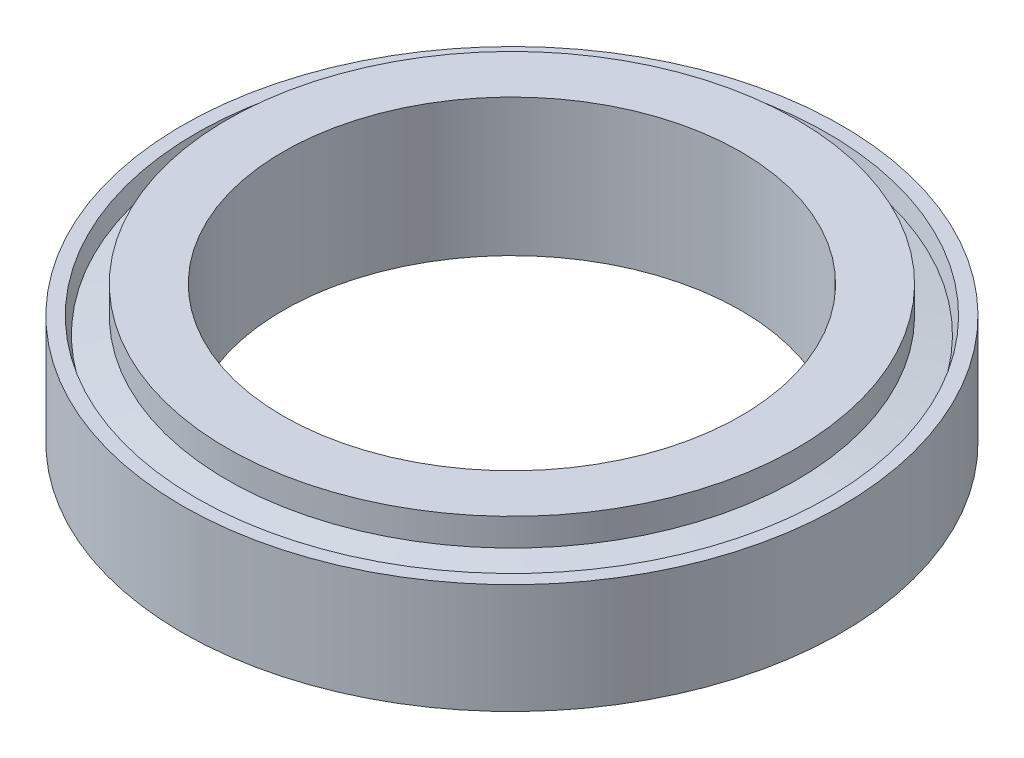
ISO-10303-21;
HEADER;
FILE_DESCRIPTION(('STEP AP214'),'2;1');
FILE_NAME('part.step','',(''),(''),'','','');
FILE_SCHEMA(('AUTOMOTIVE_DESIGN { 1 0 10303 214 1 1 1 1 }'));
ENDSEC;
DATA;
#1=APPLICATION_CONTEXT('core data for automotive mechanical design processes');
#2=APPLICATION_PROTOCOL_DEFINITION('international standard','automotive_design',2000,#1);
#3=PRODUCT_CONTEXT('',#1,'mechanical');
#4=PRODUCT('Part','Part','',(#3));
#5=PRODUCT_RELATED_PRODUCT_CATEGORY('part','',(#4));
#6=PRODUCT_DEFINITION_FORMATION('','',#4);
#7=PRODUCT_DEFINITION_CONTEXT('part definition',#1,'design');
#8=PRODUCT_DEFINITION('design','',#6,#7);
#9=PRODUCT_DEFINITION_SHAPE('','',#8);
#10=(LENGTH_UNIT() NAMED_UNIT(*) SI_UNIT(.MILLI.,.METRE.));
#11=(NAMED_UNIT(*) PLANE_ANGLE_UNIT() SI_UNIT($,.RADIAN.));
#12=(NAMED_UNIT(*) SI_UNIT($,.STERADIAN.) SOLID_ANGLE_UNIT());
#13=UNCERTAINTY_MEASURE_WITH_UNIT(LENGTH_MEASURE(1.E-05),#10,'distance_accuracy_value','');
#14=(GEOMETRIC_REPRESENTATION_CONTEXT(3) GLOBAL_UNCERTAINTY_ASSIGNED_CONTEXT((#13)) GLOBAL_UNIT_ASSIGNED_CONTEXT((#10,
#11,#12)) REPRESENTATION_CONTEXT('',''));
#15=CARTESIAN_POINT('',(0.,0.,0.));
#16=DIRECTION('',(0.,0.,1.));
#17=DIRECTION('',(1.,0.,0.));
#18=AXIS2_PLACEMENT_3D('',#15,#16,#17);
#19=CARTESIAN_POINT('',(0.,0.377136413119831,0.));
#20=DIRECTION('',(0.,1.,0.));
#21=DIRECTION('',(0.,0.,1.));
#22=AXIS2_PLACEMENT_3D('',#19,#20,#21);
#23=CONICAL_SURFACE('',#22,32.0417935505717,0.199928576912014);
#24=CARTESIAN_POINT('',(0.,10.1779440623052,0.));
#25=DIRECTION('',(0.,1.,0.));
#26=DIRECTION('',(0.,0.,1.));
#27=AXIS2_PLACEMENT_3D('',#24,#25,#26);
#28=CIRCLE('',#27,34.0277868596414);
#29=CARTESIAN_POINT('',(0.,10.1779440623052,34.0277868596414));
#30=VERTEX_POINT('',#29);
#31=EDGE_CURVE('E62',#30,#30,#28,.T.);
#32=ORIENTED_EDGE('',*,*,#31,.F.);
#33=EDGE_LOOP('',(#32));
#34=FACE_BOUND('',#33,.T.);
#35=CARTESIAN_POINT('',(0.,0.377136413119831,0.));
#36=DIRECTION('',(0.,1.,0.));
#37=DIRECTION('',(0.,0.,1.));
#38=AXIS2_PLACEMENT_3D('',#35,#36,#37);
#39=CIRCLE('',#38,32.0417935505717);
#40=CARTESIAN_POINT('',(0.,0.377136413119831,32.0417935505717));
#41=VERTEX_POINT('',#40);
#42=EDGE_CURVE('E11',#41,#41,#39,.T.);
#43=ORIENTED_EDGE('',*,*,#42,.T.);
#44=EDGE_LOOP('',(#43));
#45=FACE_BOUND('',#44,.T.);
#46=ADVANCED_FACE('F48',(#34,#45),#23,.T.);
#47=CARTESIAN_POINT('',(0.,1.30854665495114,0.));
#48=DIRECTION('',(0.,-1.,0.));
#49=DIRECTION('',(0.,0.,-1.));
#50=AXIS2_PLACEMENT_3D('',#47,#48,#49);
#51=CONICAL_SURFACE('',#50,26.7456725404506,1.39671003661078);
#52=ORIENTED_EDGE('',*,*,#42,.F.);
#53=EDGE_LOOP('',(#52));
#54=FACE_BOUND('',#53,.T.);
#55=CARTESIAN_POINT('',(0.,1.30854665495114,0.));
#56=DIRECTION('',(0.,1.,0.));
#57=DIRECTION('',(0.,0.,1.));
#58=AXIS2_PLACEMENT_3D('',#55,#56,#57);
#59=CIRCLE('',#58,26.7456725404506);
#60=CARTESIAN_POINT('',(0.,1.30854665495114,26.7456725404506));
#61=VERTEX_POINT('',#60);
#62=EDGE_CURVE('E53',#61,#61,#59,.T.);
#63=ORIENTED_EDGE('',*,*,#62,.T.);
#64=EDGE_LOOP('',(#63));
#65=FACE_BOUND('',#64,.T.);
#66=ADVANCED_FACE('F72',(#54,#65),#51,.F.);
#67=CARTESIAN_POINT('',(0.,11.1541103105243,0.));
#68=DIRECTION('',(0.,1.,0.));
#69=DIRECTION('',(0.,0.,1.));
#70=AXIS2_PLACEMENT_3D('',#67,#68,#69);
#71=CONICAL_SURFACE('',#70,28.477177316848,0.174086290184117);
#72=ORIENTED_EDGE('',*,*,#62,.F.);
#73=EDGE_LOOP('',(#72));
#74=FACE_BOUND('',#73,.T.);
#75=CARTESIAN_POINT('',(0.,11.1541103105243,0.));
#76=DIRECTION('',(0.,1.,0.));
#77=DIRECTION('',(0.,0.,1.));
#78=AXIS2_PLACEMENT_3D('',#75,#76,#77);
#79=CIRCLE('',#78,28.477177316848);
#80=CARTESIAN_POINT('',(0.,11.1541103105243,28.477177316848));
#81=VERTEX_POINT('',#80);
#82=EDGE_CURVE('E59',#81,#81,#79,.T.);
#83=ORIENTED_EDGE('',*,*,#82,.T.);
#84=EDGE_LOOP('',(#83));
#85=FACE_BOUND('',#84,.T.);
#86=ADVANCED_FACE('F73',(#74,#85),#71,.F.);
#87=CARTESIAN_POINT('',(0.,10.1779440623052,0.));
#88=DIRECTION('',(0.,-1.,0.));
#89=DIRECTION('',(0.,0.,-1.));
#90=AXIS2_PLACEMENT_3D('',#87,#88,#89);
#91=CONICAL_SURFACE('',#90,34.0277868596414,1.39671003661078);
#92=ORIENTED_EDGE('',*,*,#82,.F.);
#93=EDGE_LOOP('',(#92));
#94=FACE_BOUND('',#93,.T.);
#95=ORIENTED_EDGE('',*,*,#31,.T.);
#96=EDGE_LOOP('',(#95));
#97=FACE_BOUND('',#96,.T.);
#98=ADVANCED_FACE('F66',(#94,#97),#91,.T.);
#99=CLOSED_SHELL('',(#46,#66,#86,#98));
#100=MANIFOLD_SOLID_BREP('B2',#99);
#101=CARTESIAN_POINT('',(0.,0.,0.));
#102=DIRECTION('',(0.,1.,0.));
#103=DIRECTION('',(0.,0.,1.));
#104=AXIS2_PLACEMENT_3D('',#101,#102,#103);
#105=CONICAL_SURFACE('',#104,26.5,0.173245666452365);
#106=CARTESIAN_POINT('',(0.,12.,0.));
#107=DIRECTION('',(0.,-1.,0.));
#108=DIRECTION('',(0.,0.,-1.));
#109=AXIS2_PLACEMENT_3D('',#106,#107,#108);
#110=CIRCLE('',#109,28.6);
#111=CARTESIAN_POINT('',(0.,12.,-28.6));
#112=VERTEX_POINT('',#111);
#113=EDGE_CURVE('E139',#112,#112,#110,.T.);
#114=ORIENTED_EDGE('',*,*,#113,.T.);
#115=EDGE_LOOP('',(#114));
#116=FACE_BOUND('',#115,.T.);
#117=CARTESIAN_POINT('',(0.,0.,0.));
#118=DIRECTION('',(0.,-1.,0.));
#119=DIRECTION('',(0.,0.,-1.));
#120=AXIS2_PLACEMENT_3D('',#117,#118,#119);
#121=CIRCLE('',#120,26.5);
#122=CARTESIAN_POINT('',(0.,0.,-26.5));
#123=VERTEX_POINT('',#122);
#124=EDGE_CURVE('E50',#123,#123,#121,.T.);
#125=ORIENTED_EDGE('',*,*,#124,.F.);
#126=EDGE_LOOP('',(#125));
#127=FACE_BOUND('',#126,.T.);
#128=ADVANCED_FACE('F117',(#116,#127),#105,.T.);
#129=CARTESIAN_POINT('',(26.5,0.,0.));
#130=DIRECTION('',(0.,-1.,0.));
#131=DIRECTION('',(0.,0.,-1.));
#132=AXIS2_PLACEMENT_3D('',#129,#130,#131);
#133=PLANE('',#132);
#134=ORIENTED_EDGE('',*,*,#124,.T.);
#135=EDGE_LOOP('',(#134));
#136=FACE_BOUND('',#135,.T.);
#137=CARTESIAN_POINT('',(0.,0.,0.));
#138=DIRECTION('',(0.,-1.,0.));
#139=DIRECTION('',(0.,0.,-1.));
#140=AXIS2_PLACEMENT_3D('',#137,#138,#139);
#141=CIRCLE('',#140,25.);
#142=CARTESIAN_POINT('',(0.,0.,-25.));
#143=VERTEX_POINT('',#142);
#144=EDGE_CURVE('E121',#143,#143,#141,.T.);
#145=ORIENTED_EDGE('',*,*,#144,.F.);
#146=EDGE_LOOP('',(#145));
#147=FACE_BOUND('',#146,.T.);
#148=ADVANCED_FACE('F160',(#136,#147),#133,.T.);
#149=CARTESIAN_POINT('',(0.,0.,0.));
#150=DIRECTION('',(0.,-1.,0.));
#151=DIRECTION('',(0.,0.,-1.));
#152=AXIS2_PLACEMENT_3D('',#149,#150,#151);
#153=CYLINDRICAL_SURFACE('',#152,25.);
#154=ORIENTED_EDGE('',*,*,#144,.T.);
#155=EDGE_LOOP('',(#154));
#156=FACE_BOUND('',#155,.T.);
#157=CARTESIAN_POINT('',(0.,15.,0.));
#158=DIRECTION('',(0.,-1.,0.));
#159=DIRECTION('',(0.,0.,-1.));
#160=AXIS2_PLACEMENT_3D('',#157,#158,#159);
#161=CIRCLE('',#160,25.);
#162=CARTESIAN_POINT('',(0.,15.,-25.));
#163=VERTEX_POINT('',#162);
#164=EDGE_CURVE('E130',#163,#163,#161,.T.);
#165=ORIENTED_EDGE('',*,*,#164,.F.);
#166=EDGE_LOOP('',(#165));
#167=FACE_BOUND('',#166,.T.);
#168=ADVANCED_FACE('F161',(#156,#167),#153,.F.);
#169=CARTESIAN_POINT('',(25.,15.,0.));
#170=DIRECTION('',(0.,1.,0.));
#171=DIRECTION('',(0.,0.,1.));
#172=AXIS2_PLACEMENT_3D('',#169,#170,#171);
#173=PLANE('',#172);
#174=ORIENTED_EDGE('',*,*,#164,.T.);
#175=EDGE_LOOP('',(#174));
#176=FACE_BOUND('',#175,.T.);
#177=CARTESIAN_POINT('',(0.,15.,0.));
#178=DIRECTION('',(0.,-1.,0.));
#179=DIRECTION('',(0.,0.,-1.));
#180=AXIS2_PLACEMENT_3D('',#177,#178,#179);
#181=CIRCLE('',#180,31.1);
#182=CARTESIAN_POINT('',(0.,15.,-31.1));
#183=VERTEX_POINT('',#182);
#184=EDGE_CURVE('E131',#183,#183,#181,.T.);
#185=ORIENTED_EDGE('',*,*,#184,.F.);
#186=EDGE_LOOP('',(#185));
#187=FACE_BOUND('',#186,.T.);
#188=ADVANCED_FACE('F153',(#176,#187),#173,.T.);
#189=CARTESIAN_POINT('',(0.,0.,0.));
#190=DIRECTION('',(0.,-1.,0.));
#191=DIRECTION('',(0.,0.,-1.));
#192=AXIS2_PLACEMENT_3D('',#189,#190,#191);
#193=CYLINDRICAL_SURFACE('',#192,31.1);
#194=ORIENTED_EDGE('',*,*,#184,.T.);
#195=EDGE_LOOP('',(#194));
#196=FACE_BOUND('',#195,.T.);
#197=CARTESIAN_POINT('',(0.,12.,0.));
#198=DIRECTION('',(0.,-1.,0.));
#199=DIRECTION('',(0.,0.,-1.));
#200=AXIS2_PLACEMENT_3D('',#197,#198,#199);
#201=CIRCLE('',#200,31.1);
#202=CARTESIAN_POINT('',(0.,12.,-31.1));
#203=VERTEX_POINT('',#202);
#204=EDGE_CURVE('E138',#203,#203,#201,.T.);
#205=ORIENTED_EDGE('',*,*,#204,.F.);
#206=EDGE_LOOP('',(#205));
#207=FACE_BOUND('',#206,.T.);
#208=ADVANCED_FACE('F150',(#196,#207),#193,.T.);
#209=CARTESIAN_POINT('',(31.1,12.,0.));
#210=DIRECTION('',(0.,-1.,0.));
#211=DIRECTION('',(0.,0.,-1.));
#212=AXIS2_PLACEMENT_3D('',#209,#210,#211);
#213=PLANE('',#212);
#214=ORIENTED_EDGE('',*,*,#204,.T.);
#215=EDGE_LOOP('',(#214));
#216=FACE_BOUND('',#215,.T.);
#217=ORIENTED_EDGE('',*,*,#113,.F.);
#218=EDGE_LOOP('',(#217));
#219=FACE_BOUND('',#218,.T.);
#220=ADVANCED_FACE('F144',(#216,#219),#213,.T.);
#221=CLOSED_SHELL('',(#128,#148,#168,#188,#208,#220));
#222=MANIFOLD_SOLID_BREP('B6',#221);
#223=CARTESIAN_POINT('',(0.,12.,0.));
#224=DIRECTION('',(0.,1.,0.));
#225=DIRECTION('',(0.,0.,1.));
#226=AXIS2_PLACEMENT_3D('',#223,#224,#225);
#227=CONICAL_SURFACE('',#226,34.5,0.205395389189768);
#228=CARTESIAN_POINT('',(0.,0.,0.));
#229=DIRECTION('',(0.,1.,0.));
#230=DIRECTION('',(0.,0.,1.));
#231=AXIS2_PLACEMENT_3D('',#228,#229,#230);
#232=CIRCLE('',#231,32.);
#233=CARTESIAN_POINT('',(0.,0.,32.));
#234=VERTEX_POINT('',#233);
#235=EDGE_CURVE('E116',#234,#234,#232,.T.);
#236=ORIENTED_EDGE('',*,*,#235,.F.);
#237=EDGE_LOOP('',(#236));
#238=FACE_BOUND('',#237,.T.);
#239=CARTESIAN_POINT('',(0.,12.,0.));
#240=DIRECTION('',(0.,1.,0.));
#241=DIRECTION('',(0.,0.,1.));
#242=AXIS2_PLACEMENT_3D('',#239,#240,#241);
#243=CIRCLE('',#242,34.5);
#244=CARTESIAN_POINT('',(0.,12.,34.5));
#245=VERTEX_POINT('',#244);
#246=EDGE_CURVE('E224',#245,#245,#243,.T.);
#247=ORIENTED_EDGE('',*,*,#246,.T.);
#248=EDGE_LOOP('',(#247));
#249=FACE_BOUND('',#248,.T.);
#250=ADVANCED_FACE('F207',(#238,#249),#227,.F.);
#251=CARTESIAN_POINT('',(32.,0.,0.));
#252=DIRECTION('',(0.,1.,0.));
#253=DIRECTION('',(0.,0.,1.));
#254=AXIS2_PLACEMENT_3D('',#251,#252,#253);
#255=PLANE('',#254);
#256=CARTESIAN_POINT('',(0.,0.,0.));
#257=DIRECTION('',(0.,1.,0.));
#258=DIRECTION('',(0.,0.,1.));
#259=AXIS2_PLACEMENT_3D('',#256,#257,#258);
#260=CIRCLE('',#259,36.0000000000021);
#261=CARTESIAN_POINT('',(0.,0.,36.0000000000021));
#262=VERTEX_POINT('',#261);
#263=EDGE_CURVE('E214',#262,#262,#260,.T.);
#264=ORIENTED_EDGE('',*,*,#263,.F.);
#265=EDGE_LOOP('',(#264));
#266=FACE_BOUND('',#265,.T.);
#267=ORIENTED_EDGE('',*,*,#235,.T.);
#268=EDGE_LOOP('',(#267));
#269=FACE_BOUND('',#268,.T.);
#270=ADVANCED_FACE('F236',(#266,#269),#255,.F.);
#271=CARTESIAN_POINT('',(0.,0.,0.));
#272=DIRECTION('',(0.,1.,0.));
#273=DIRECTION('',(0.,0.,1.));
#274=AXIS2_PLACEMENT_3D('',#271,#272,#273);
#275=CYLINDRICAL_SURFACE('',#274,36.0000000000011);
#276=CARTESIAN_POINT('',(0.,12.,0.));
#277=DIRECTION('',(0.,1.,0.));
#278=DIRECTION('',(0.,0.,1.));
#279=AXIS2_PLACEMENT_3D('',#276,#277,#278);
#280=CIRCLE('',#279,36.);
#281=CARTESIAN_POINT('',(0.,12.,36.));
#282=VERTEX_POINT('',#281);
#283=EDGE_CURVE('E218',#282,#282,#280,.T.);
#284=ORIENTED_EDGE('',*,*,#283,.F.);
#285=EDGE_LOOP('',(#284));
#286=FACE_BOUND('',#285,.T.);
#287=ORIENTED_EDGE('',*,*,#263,.T.);
#288=EDGE_LOOP('',(#287));
#289=FACE_BOUND('',#288,.T.);
#290=ADVANCED_FACE('F231',(#286,#289),#275,.T.);
#291=CARTESIAN_POINT('',(36.,12.,0.));
#292=DIRECTION('',(0.,-1.,0.));
#293=DIRECTION('',(0.,0.,-1.));
#294=AXIS2_PLACEMENT_3D('',#291,#292,#293);
#295=PLANE('',#294);
#296=ORIENTED_EDGE('',*,*,#246,.F.);
#297=EDGE_LOOP('',(#296));
#298=FACE_BOUND('',#297,.T.);
#299=ORIENTED_EDGE('',*,*,#283,.T.);
#300=EDGE_LOOP('',(#299));
#301=FACE_BOUND('',#300,.T.);
#302=ADVANCED_FACE('F230',(#298,#301),#295,.F.);
#303=CLOSED_SHELL('',(#250,#270,#290,#302));
#304=MANIFOLD_SOLID_BREP('B45',#303);
#305=ADVANCED_BREP_SHAPE_REPRESENTATION('',(#18,#100,#222,#304),#14);
#306=SHAPE_DEFINITION_REPRESENTATION(#9,#305);
ENDSEC;
END-ISO-10303-21;
